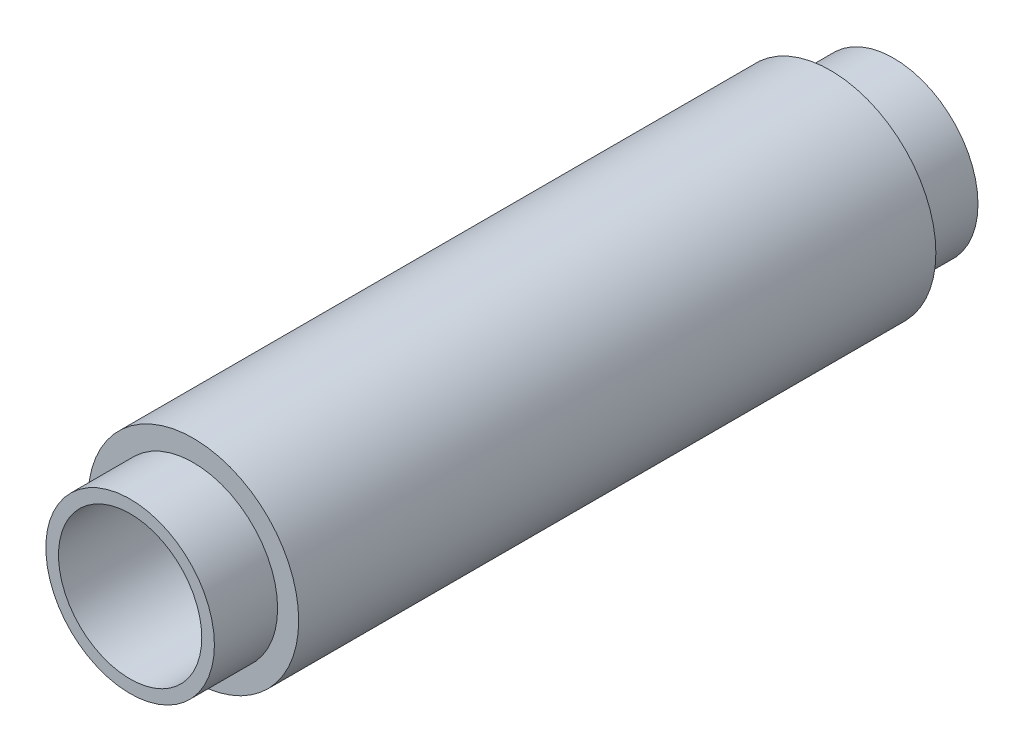
ISO-10303-21;
HEADER;
FILE_DESCRIPTION(('STEP AP214'),'2;1');
FILE_NAME('part.step','',(''),(''),'','','');
FILE_SCHEMA(('AUTOMOTIVE_DESIGN { 1 0 10303 214 1 1 1 1 }'));
ENDSEC;
DATA;
#1=APPLICATION_CONTEXT('core data for automotive mechanical design processes');
#2=APPLICATION_PROTOCOL_DEFINITION('international standard','automotive_design',2000,#1);
#3=PRODUCT_CONTEXT('',#1,'mechanical');
#4=PRODUCT('Part','Part','',(#3));
#5=PRODUCT_RELATED_PRODUCT_CATEGORY('part','',(#4));
#6=PRODUCT_DEFINITION_FORMATION('','',#4);
#7=PRODUCT_DEFINITION_CONTEXT('part definition',#1,'design');
#8=PRODUCT_DEFINITION('design','',#6,#7);
#9=PRODUCT_DEFINITION_SHAPE('','',#8);
#10=(LENGTH_UNIT() NAMED_UNIT(*) SI_UNIT(.MILLI.,.METRE.));
#11=(NAMED_UNIT(*) PLANE_ANGLE_UNIT() SI_UNIT($,.RADIAN.));
#12=(NAMED_UNIT(*) SI_UNIT($,.STERADIAN.) SOLID_ANGLE_UNIT());
#13=UNCERTAINTY_MEASURE_WITH_UNIT(LENGTH_MEASURE(1.E-05),#10,'distance_accuracy_value','');
#14=(GEOMETRIC_REPRESENTATION_CONTEXT(3) GLOBAL_UNCERTAINTY_ASSIGNED_CONTEXT((#13)) GLOBAL_UNIT_ASSIGNED_CONTEXT((#10,
#11,#12)) REPRESENTATION_CONTEXT('',''));
#15=CARTESIAN_POINT('',(0.,0.,0.));
#16=DIRECTION('',(0.,0.,1.));
#17=DIRECTION('',(1.,0.,0.));
#18=AXIS2_PLACEMENT_3D('',#15,#16,#17);
#19=CARTESIAN_POINT('',(3.43024899888577E-12,0.,1000.));
#20=DIRECTION('',(0.,0.,1.));
#21=DIRECTION('',(1.,0.,0.));
#22=AXIS2_PLACEMENT_3D('',#19,#20,#21);
#23=CYLINDRICAL_SURFACE('',#22,25.0000000000001);
#24=CARTESIAN_POINT('',(2.59326824315763E-13,0.,75.5999999999997));
#25=DIRECTION('',(0.,0.,1.));
#26=DIRECTION('',(1.,0.,0.));
#27=AXIS2_PLACEMENT_3D('',#24,#25,#26);
#28=CIRCLE('',#27,25.0000000000003);
#29=CARTESIAN_POINT('',(25.0000000000005,0.,75.5999999999996));
#30=VERTEX_POINT('',#29);
#31=EDGE_CURVE('E47',#30,#30,#28,.T.);
#32=ORIENTED_EDGE('',*,*,#31,.F.);
#33=EDGE_LOOP('',(#32));
#34=FACE_BOUND('',#33,.T.);
#35=CARTESIAN_POINT('',(-2.59326824315763E-13,0.,-75.5999999999997));
#36=DIRECTION('',(0.,0.,1.));
#37=DIRECTION('',(1.,0.,0.));
#38=AXIS2_PLACEMENT_3D('',#35,#36,#37);
#39=CIRCLE('',#38,25.0000000000003);
#40=CARTESIAN_POINT('',(25.,0.,-75.5999999999998));
#41=VERTEX_POINT('',#40);
#42=EDGE_CURVE('E61',#41,#41,#39,.T.);
#43=ORIENTED_EDGE('',*,*,#42,.T.);
#44=EDGE_LOOP('',(#43));
#45=FACE_BOUND('',#44,.T.);
#46=ADVANCED_FACE('F33',(#34,#45),#23,.T.);
#47=CARTESIAN_POINT('',(3.43024899888577E-12,0.,1000.));
#48=DIRECTION('',(0.,0.,1.));
#49=DIRECTION('',(1.,0.,0.));
#50=AXIS2_PLACEMENT_3D('',#47,#48,#49);
#51=CYLINDRICAL_SURFACE('',#50,17.0000000000002);
#52=CARTESIAN_POINT('',(3.10780559299049E-13,0.,90.5999999999997));
#53=DIRECTION('',(0.,0.,1.));
#54=DIRECTION('',(1.,0.,0.));
#55=AXIS2_PLACEMENT_3D('',#52,#53,#54);
#56=CIRCLE('',#55,17.0000000000003);
#57=CARTESIAN_POINT('',(17.0000000000006,0.,90.5999999999996));
#58=VERTEX_POINT('',#57);
#59=EDGE_CURVE('E10',#58,#58,#56,.T.);
#60=ORIENTED_EDGE('',*,*,#59,.T.);
#61=EDGE_LOOP('',(#60));
#62=FACE_BOUND('',#61,.T.);
#63=CARTESIAN_POINT('',(-3.10780559299049E-13,0.,-90.5999999999997));
#64=DIRECTION('',(0.,0.,1.));
#65=DIRECTION('',(1.,0.,0.));
#66=AXIS2_PLACEMENT_3D('',#63,#64,#65);
#67=CIRCLE('',#66,17.0000000000003);
#68=CARTESIAN_POINT('',(17.,0.,-90.5999999999997));
#69=VERTEX_POINT('',#68);
#70=EDGE_CURVE('E52',#69,#69,#67,.T.);
#71=ORIENTED_EDGE('',*,*,#70,.F.);
#72=EDGE_LOOP('',(#71));
#73=FACE_BOUND('',#72,.T.);
#74=ADVANCED_FACE('F78',(#62,#73),#51,.F.);
#75=CARTESIAN_POINT('',(-20.,0.,90.5999999999998));
#76=DIRECTION('',(0.,0.,-1.));
#77=DIRECTION('',(-1.,0.,0.));
#78=AXIS2_PLACEMENT_3D('',#75,#76,#77);
#79=PLANE('',#78);
#80=ORIENTED_EDGE('',*,*,#59,.F.);
#81=EDGE_LOOP('',(#80));
#82=FACE_BOUND('',#81,.T.);
#83=CARTESIAN_POINT('',(3.10780559299049E-13,0.,90.5999999999997));
#84=DIRECTION('',(0.,0.,1.));
#85=DIRECTION('',(1.,0.,0.));
#86=AXIS2_PLACEMENT_3D('',#83,#84,#85);
#87=CIRCLE('',#86,20.0000000000003);
#88=CARTESIAN_POINT('',(20.0000000000006,0.,90.5999999999996));
#89=VERTEX_POINT('',#88);
#90=EDGE_CURVE('E39',#89,#89,#87,.T.);
#91=ORIENTED_EDGE('',*,*,#90,.T.);
#92=EDGE_LOOP('',(#91));
#93=FACE_BOUND('',#92,.T.);
#94=ADVANCED_FACE('F83',(#82,#93),#79,.F.);
#95=CARTESIAN_POINT('',(3.43024899888577E-12,0.,1000.));
#96=DIRECTION('',(0.,0.,1.));
#97=DIRECTION('',(1.,0.,0.));
#98=AXIS2_PLACEMENT_3D('',#95,#96,#97);
#99=CYLINDRICAL_SURFACE('',#98,20.0000000000003);
#100=ORIENTED_EDGE('',*,*,#90,.F.);
#101=EDGE_LOOP('',(#100));
#102=FACE_BOUND('',#101,.T.);
#103=CARTESIAN_POINT('',(2.59326824315763E-13,0.,75.5999999999997));
#104=DIRECTION('',(0.,0.,1.));
#105=DIRECTION('',(1.,0.,0.));
#106=AXIS2_PLACEMENT_3D('',#103,#104,#105);
#107=CIRCLE('',#106,20.0000000000003);
#108=CARTESIAN_POINT('',(20.0000000000005,0.,75.5999999999996));
#109=VERTEX_POINT('',#108);
#110=EDGE_CURVE('E43',#109,#109,#107,.T.);
#111=ORIENTED_EDGE('',*,*,#110,.T.);
#112=EDGE_LOOP('',(#111));
#113=FACE_BOUND('',#112,.T.);
#114=ADVANCED_FACE('F88',(#102,#113),#99,.T.);
#115=CARTESIAN_POINT('',(-20.,0.,75.5999999999998));
#116=DIRECTION('',(0.,0.,-1.));
#117=DIRECTION('',(-1.,0.,0.));
#118=AXIS2_PLACEMENT_3D('',#115,#116,#117);
#119=PLANE('',#118);
#120=ORIENTED_EDGE('',*,*,#110,.F.);
#121=EDGE_LOOP('',(#120));
#122=FACE_BOUND('',#121,.T.);
#123=ORIENTED_EDGE('',*,*,#31,.T.);
#124=EDGE_LOOP('',(#123));
#125=FACE_BOUND('',#124,.T.);
#126=ADVANCED_FACE('F86',(#122,#125),#119,.F.);
#127=CARTESIAN_POINT('',(-20.0000000000006,0.,-90.5999999999997));
#128=DIRECTION('',(0.,0.,1.));
#129=DIRECTION('',(-1.,0.,0.));
#130=AXIS2_PLACEMENT_3D('',#127,#128,#129);
#131=PLANE('',#130);
#132=ORIENTED_EDGE('',*,*,#70,.T.);
#133=EDGE_LOOP('',(#132));
#134=FACE_BOUND('',#133,.T.);
#135=CARTESIAN_POINT('',(-3.10780559299049E-13,0.,-90.5999999999997));
#136=DIRECTION('',(0.,0.,1.));
#137=DIRECTION('',(1.,0.,0.));
#138=AXIS2_PLACEMENT_3D('',#135,#136,#137);
#139=CIRCLE('',#138,20.0000000000003);
#140=CARTESIAN_POINT('',(20.,0.,-90.5999999999998));
#141=VERTEX_POINT('',#140);
#142=EDGE_CURVE('E55',#141,#141,#139,.T.);
#143=ORIENTED_EDGE('',*,*,#142,.F.);
#144=EDGE_LOOP('',(#143));
#145=FACE_BOUND('',#144,.T.);
#146=ADVANCED_FACE('F74',(#134,#145),#131,.F.);
#147=CARTESIAN_POINT('',(-3.43024899888577E-12,0.,-1000.));
#148=DIRECTION('',(0.,0.,-1.));
#149=DIRECTION('',(1.,0.,0.));
#150=AXIS2_PLACEMENT_3D('',#147,#148,#149);
#151=CYLINDRICAL_SURFACE('',#150,20.0000000000003);
#152=ORIENTED_EDGE('',*,*,#142,.T.);
#153=EDGE_LOOP('',(#152));
#154=FACE_BOUND('',#153,.T.);
#155=CARTESIAN_POINT('',(-2.59326824315763E-13,0.,-75.5999999999997));
#156=DIRECTION('',(0.,0.,1.));
#157=DIRECTION('',(1.,0.,0.));
#158=AXIS2_PLACEMENT_3D('',#155,#156,#157);
#159=CIRCLE('',#158,20.0000000000003);
#160=CARTESIAN_POINT('',(20.,0.,-75.5999999999997));
#161=VERTEX_POINT('',#160);
#162=EDGE_CURVE('E58',#161,#161,#159,.T.);
#163=ORIENTED_EDGE('',*,*,#162,.F.);
#164=EDGE_LOOP('',(#163));
#165=FACE_BOUND('',#164,.T.);
#166=ADVANCED_FACE('F68',(#154,#165),#151,.T.);
#167=CARTESIAN_POINT('',(-20.0000000000005,0.,-75.5999999999997));
#168=DIRECTION('',(0.,0.,1.));
#169=DIRECTION('',(-1.,0.,0.));
#170=AXIS2_PLACEMENT_3D('',#167,#168,#169);
#171=PLANE('',#170);
#172=ORIENTED_EDGE('',*,*,#162,.T.);
#173=EDGE_LOOP('',(#172));
#174=FACE_BOUND('',#173,.T.);
#175=ORIENTED_EDGE('',*,*,#42,.F.);
#176=EDGE_LOOP('',(#175));
#177=FACE_BOUND('',#176,.T.);
#178=ADVANCED_FACE('F66',(#174,#177),#171,.F.);
#179=CLOSED_SHELL('',(#46,#74,#94,#114,#126,#146,#166,#178));
#180=MANIFOLD_SOLID_BREP('B2',#179);
#181=ADVANCED_BREP_SHAPE_REPRESENTATION('',(#18,#180),#14);
#182=SHAPE_DEFINITION_REPRESENTATION(#9,#181);
ENDSEC;
END-ISO-10303-21;
